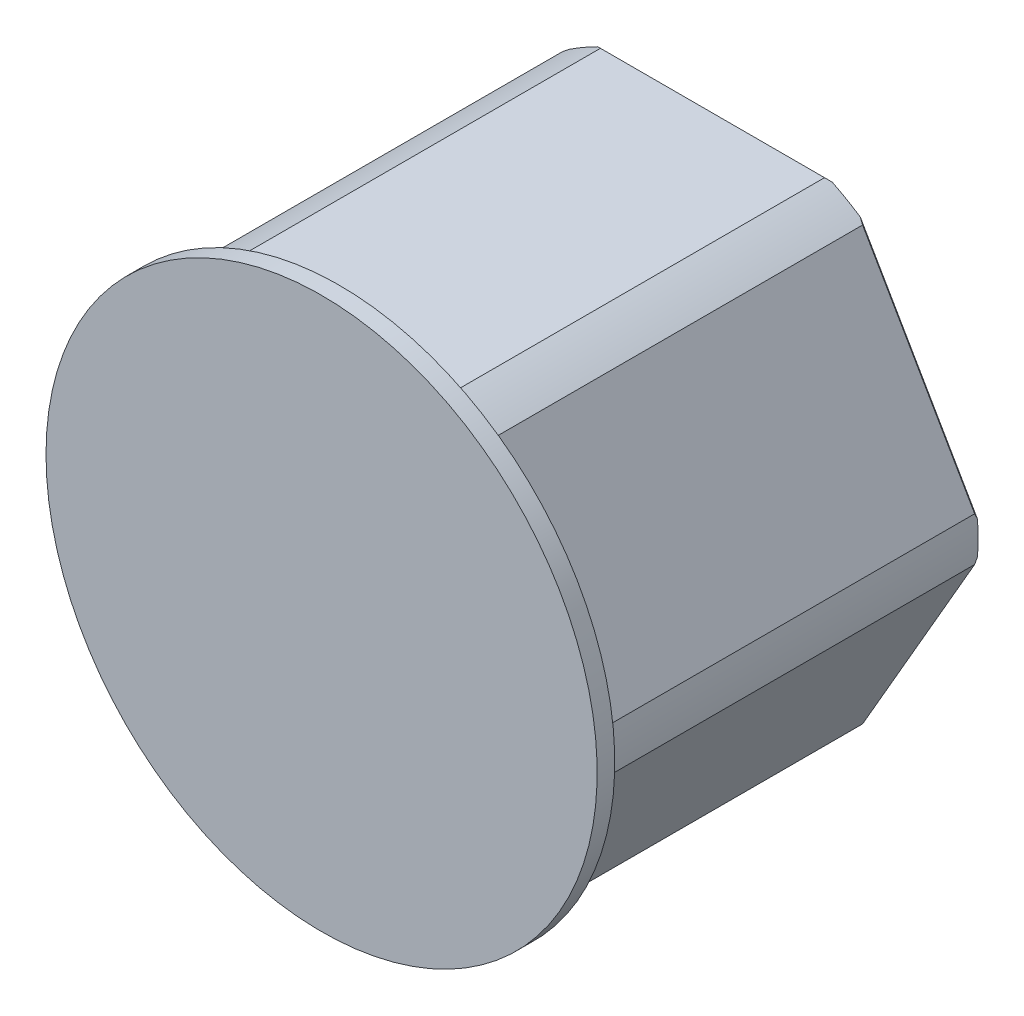
ISO-10303-21;
HEADER;
FILE_DESCRIPTION(('STEP AP214'),'2;1');
FILE_NAME('part.step','',(''),(''),'','','');
FILE_SCHEMA(('AUTOMOTIVE_DESIGN { 1 0 10303 214 1 1 1 1 }'));
ENDSEC;
DATA;
#1=APPLICATION_CONTEXT('core data for automotive mechanical design processes');
#2=APPLICATION_PROTOCOL_DEFINITION('international standard','automotive_design',2000,#1);
#3=PRODUCT_CONTEXT('',#1,'mechanical');
#4=PRODUCT('Part','Part','',(#3));
#5=PRODUCT_RELATED_PRODUCT_CATEGORY('part','',(#4));
#6=PRODUCT_DEFINITION_FORMATION('','',#4);
#7=PRODUCT_DEFINITION_CONTEXT('part definition',#1,'design');
#8=PRODUCT_DEFINITION('design','',#6,#7);
#9=PRODUCT_DEFINITION_SHAPE('','',#8);
#10=(LENGTH_UNIT() NAMED_UNIT(*) SI_UNIT(.MILLI.,.METRE.));
#11=(NAMED_UNIT(*) PLANE_ANGLE_UNIT() SI_UNIT($,.RADIAN.));
#12=(NAMED_UNIT(*) SI_UNIT($,.STERADIAN.) SOLID_ANGLE_UNIT());
#13=UNCERTAINTY_MEASURE_WITH_UNIT(LENGTH_MEASURE(1.E-05),#10,'distance_accuracy_value','');
#14=(GEOMETRIC_REPRESENTATION_CONTEXT(3) GLOBAL_UNCERTAINTY_ASSIGNED_CONTEXT((#13)) GLOBAL_UNIT_ASSIGNED_CONTEXT((#10,
#11,#12)) REPRESENTATION_CONTEXT('',''));
#15=CARTESIAN_POINT('',(0.,0.,0.));
#16=DIRECTION('',(0.,0.,1.));
#17=DIRECTION('',(1.,0.,0.));
#18=AXIS2_PLACEMENT_3D('',#15,#16,#17);
#19=CARTESIAN_POINT('',(-175.,0.,-128.));
#20=DIRECTION('',(0.,0.,-1.));
#21=DIRECTION('',(-1.,0.,0.));
#22=AXIS2_PLACEMENT_3D('',#19,#20,#21);
#23=CYLINDRICAL_SURFACE('',#22,11.);
#24=CARTESIAN_POINT('',(-175.,0.,-134.297830772461));
#25=DIRECTION('',(0.,0.,1.));
#26=DIRECTION('',(-1.,0.,0.));
#27=AXIS2_PLACEMENT_3D('',#24,#25,#26);
#28=CIRCLE('',#27,11.);
#29=CARTESIAN_POINT('',(-186.,0.,-134.297830772461));
#30=VERTEX_POINT('',#29);
#31=EDGE_CURVE('E189',#30,#30,#28,.T.);
#32=ORIENTED_EDGE('',*,*,#31,.F.);
#33=EDGE_LOOP('',(#32));
#34=FACE_BOUND('',#33,.T.);
#35=CARTESIAN_POINT('',(-175.,0.,-135.));
#36=DIRECTION('',(0.,0.,-1.));
#37=DIRECTION('',(-1.,0.,0.));
#38=AXIS2_PLACEMENT_3D('',#35,#36,#37);
#39=CIRCLE('',#38,11.);
#40=CARTESIAN_POINT('',(-186.,0.,-135.));
#41=VERTEX_POINT('',#40);
#42=EDGE_CURVE('E182',#41,#41,#39,.T.);
#43=ORIENTED_EDGE('',*,*,#42,.F.);
#44=EDGE_LOOP('',(#43));
#45=FACE_BOUND('',#44,.T.);
#46=ADVANCED_FACE('F17',(#34,#45),#23,.T.);
#47=CARTESIAN_POINT('',(-175.,0.,-134.297830772461));
#48=DIRECTION('',(0.,0.,-1.));
#49=DIRECTION('',(-1.,0.,0.));
#50=AXIS2_PLACEMENT_3D('',#47,#48,#49);
#51=PLANE('',#50);
#52=ORIENTED_EDGE('',*,*,#31,.T.);
#53=EDGE_LOOP('',(#52));
#54=FACE_BOUND('',#53,.T.);
#55=ADVANCED_FACE('F683',(#54),#51,.F.);
#56=CARTESIAN_POINT('',(-175.,0.,-135.));
#57=DIRECTION('',(0.,0.,-1.));
#58=DIRECTION('',(-1.,0.,0.));
#59=AXIS2_PLACEMENT_3D('',#56,#57,#58);
#60=PLANE('',#59);
#61=CARTESIAN_POINT('',(-175.,0.,-135.));
#62=DIRECTION('',(0.,0.,-1.));
#63=DIRECTION('',(-0.425917709999994,-0.904761904761889,0.));
#64=AXIS2_PLACEMENT_3D('',#61,#62,#63);
#65=CIRCLE('',#64,10.5);
#66=CARTESIAN_POINT('',(-179.472135955,-9.5,-135.));
#67=VERTEX_POINT('',#66);
#68=CARTESIAN_POINT('',(-180.991173358452,-8.62298334620741,-135.));
#69=VERTEX_POINT('',#68);
#70=EDGE_CURVE('E162',#67,#69,#65,.T.);
#71=ORIENTED_EDGE('',*,*,#70,.F.);
#72=DIRECTION('',(-1.,0.,0.));
#73=VECTOR('',#72,1.);
#74=CARTESIAN_POINT('',(-170.527864045,-9.5,-135.));
#75=LINE('',#74,#73);
#76=CARTESIAN_POINT('',(-170.527864045,-9.5,-135.));
#77=VERTEX_POINT('',#76);
#78=EDGE_CURVE('E150',#77,#67,#75,.T.);
#79=ORIENTED_EDGE('',*,*,#78,.F.);
#80=CARTESIAN_POINT('',(-175.,0.,-135.));
#81=DIRECTION('',(0.,0.,-1.));
#82=DIRECTION('',(0.5705879389002,-0.82123650916263,0.));
#83=AXIS2_PLACEMENT_3D('',#80,#81,#82);
#84=CIRCLE('',#83,10.5);
#85=CARTESIAN_POINT('',(-169.008826641548,-8.62298334620749,-135.));
#86=VERTEX_POINT('',#85);
#87=EDGE_CURVE('E161',#86,#77,#84,.T.);
#88=ORIENTED_EDGE('',*,*,#87,.F.);
#89=DIRECTION('',(-0.5,-0.866025403784438,0.));
#90=VECTOR('',#89,1.);
#91=CARTESIAN_POINT('',(-164.536690686548,-0.877016653792699,-135.));
#92=LINE('',#91,#90);
#93=CARTESIAN_POINT('',(-164.536690686548,-0.877016653792552,-135.));
#94=VERTEX_POINT('',#93);
#95=EDGE_CURVE('E199',#94,#86,#92,.T.);
#96=ORIENTED_EDGE('',*,*,#95,.F.);
#97=CARTESIAN_POINT('',(-175.,0.,-135.));
#98=DIRECTION('',(0.,0.,-1.));
#99=DIRECTION('',(0.996505648900187,0.0835253955992873,0.));
#100=AXIS2_PLACEMENT_3D('',#97,#98,#99);
#101=CIRCLE('',#100,10.5);
#102=CARTESIAN_POINT('',(-164.536690686548,0.877016653792483,-135.));
#103=VERTEX_POINT('',#102);
#104=EDGE_CURVE('E204',#103,#94,#101,.T.);
#105=ORIENTED_EDGE('',*,*,#104,.F.);
#106=DIRECTION('',(0.499999999999998,-0.86602540378444,0.));
#107=VECTOR('',#106,1.);
#108=CARTESIAN_POINT('',(-169.008826641548,8.62298334620771,-135.));
#109=LINE('',#108,#107);
#110=CARTESIAN_POINT('',(-169.008826641548,8.62298334620742,-135.));
#111=VERTEX_POINT('',#110);
#112=EDGE_CURVE('E209',#111,#103,#109,.T.);
#113=ORIENTED_EDGE('',*,*,#112,.F.);
#114=CARTESIAN_POINT('',(-175.,0.,-135.));
#115=DIRECTION('',(0.,0.,-1.));
#116=DIRECTION('',(0.425917709999992,0.90476190476189,0.));
#117=AXIS2_PLACEMENT_3D('',#114,#115,#116);
#118=CIRCLE('',#117,10.5);
#119=CARTESIAN_POINT('',(-170.527864045,9.5,-135.));
#120=VERTEX_POINT('',#119);
#121=EDGE_CURVE('E214',#120,#111,#118,.T.);
#122=ORIENTED_EDGE('',*,*,#121,.F.);
#123=DIRECTION('',(1.,0.,0.));
#124=VECTOR('',#123,1.);
#125=CARTESIAN_POINT('',(-179.472135955,9.5,-135.));
#126=LINE('',#125,#124);
#127=CARTESIAN_POINT('',(-179.472135955,9.5,-135.));
#128=VERTEX_POINT('',#127);
#129=EDGE_CURVE('E219',#128,#120,#126,.T.);
#130=ORIENTED_EDGE('',*,*,#129,.F.);
#131=CARTESIAN_POINT('',(-175.,0.,-135.));
#132=DIRECTION('',(0.,0.,-1.));
#133=DIRECTION('',(-0.570587938900203,0.821236509162627,0.));
#134=AXIS2_PLACEMENT_3D('',#131,#132,#133);
#135=CIRCLE('',#134,10.5);
#136=CARTESIAN_POINT('',(-180.991173358452,8.62298334620734,-135.));
#137=VERTEX_POINT('',#136);
#138=EDGE_CURVE('E224',#137,#128,#135,.T.);
#139=ORIENTED_EDGE('',*,*,#138,.F.);
#140=DIRECTION('',(0.500000000000001,0.866025403784438,0.));
#141=VECTOR('',#140,1.);
#142=CARTESIAN_POINT('',(-185.463309313452,0.877016653792736,-135.));
#143=LINE('',#142,#141);
#144=CARTESIAN_POINT('',(-185.463309313452,0.877016653792622,-135.));
#145=VERTEX_POINT('',#144);
#146=EDGE_CURVE('E229',#145,#137,#143,.T.);
#147=ORIENTED_EDGE('',*,*,#146,.F.);
#148=CARTESIAN_POINT('',(-175.,0.,-135.));
#149=DIRECTION('',(0.,0.,-1.));
#150=DIRECTION('',(-0.996505648900186,-0.0835253955993006,0.));
#151=AXIS2_PLACEMENT_3D('',#148,#149,#150);
#152=CIRCLE('',#151,10.5);
#153=CARTESIAN_POINT('',(-185.463309313452,-0.877016653792695,-135.));
#154=VERTEX_POINT('',#153);
#155=EDGE_CURVE('E234',#154,#145,#152,.T.);
#156=ORIENTED_EDGE('',*,*,#155,.F.);
#157=DIRECTION('',(-0.499999999999999,0.866025403784439,0.));
#158=VECTOR('',#157,1.);
#159=CARTESIAN_POINT('',(-180.991173358453,-8.62298334620772,-135.));
#160=LINE('',#159,#158);
#161=EDGE_CURVE('E180',#69,#154,#160,.T.);
#162=ORIENTED_EDGE('',*,*,#161,.F.);
#163=EDGE_LOOP('',(#71,#79,#88,#96,#105,#113,#122,#130,#139,#147,#156,#162));
#164=FACE_BOUND('',#163,.T.);
#165=ORIENTED_EDGE('',*,*,#42,.T.);
#166=EDGE_LOOP('',(#165));
#167=FACE_BOUND('',#166,.T.);
#168=ADVANCED_FACE('F177',(#164,#167),#60,.T.);
#169=CARTESIAN_POINT('',(-175.,0.,-135.));
#170=DIRECTION('',(0.,0.,-1.));
#171=DIRECTION('',(-1.,0.,0.));
#172=AXIS2_PLACEMENT_3D('',#169,#170,#171);
#173=CYLINDRICAL_SURFACE('',#172,10.5);
#174=CARTESIAN_POINT('',(-180.801301282516,-8.75185142866796,-150.000000000001));
#175=CARTESIAN_POINT('',(-180.833122793573,-8.73075804352367,-149.98298845561));
#176=CARTESIAN_POINT('',(-180.864942696883,-8.70941502160958,-149.966103121955));
#177=CARTESIAN_POINT('',(-180.928236057827,-8.66645718266959,-149.932768382957));
#178=CARTESIAN_POINT('',(-180.959707281261,-8.64484570124045,-149.916319244689));
#179=CARTESIAN_POINT('',(-180.991173358452,-8.62298334620747,-149.900000000001));
#180=B_SPLINE_CURVE_WITH_KNOTS('',3,(#174,#175,#176,#177,#178,#179),.UNSPECIFIED.,.F.,.F.,(4,2,
4),(2.67976158239654,2.6906891405977,2.70161669879885),.UNSPECIFIED.);
#181=CARTESIAN_POINT('',(-180.801301282516,-8.75185142866817,-150.));
#182=VERTEX_POINT('',#181);
#183=CARTESIAN_POINT('',(-180.991173358452,-8.62298334620742,-149.9));
#184=VERTEX_POINT('',#183);
#185=EDGE_CURVE('E243',#182,#184,#180,.T.);
#186=ORIENTED_EDGE('',*,*,#185,.F.);
#187=CARTESIAN_POINT('',(-175.,0.,-150.));
#188=DIRECTION('',(0.,0.,-1.));
#189=DIRECTION('',(-0.445588097725331,-0.895238095238089,0.));
#190=AXIS2_PLACEMENT_3D('',#187,#188,#189);
#191=CIRCLE('',#190,10.5);
#192=CARTESIAN_POINT('',(-179.678675026116,-9.4,-150.));
#193=VERTEX_POINT('',#192);
#194=EDGE_CURVE('E251',#193,#182,#191,.T.);
#195=ORIENTED_EDGE('',*,*,#194,.F.);
#196=CARTESIAN_POINT('',(-179.472135955,-9.49999999999948,-149.900000000001));
#197=CARTESIAN_POINT('',(-179.50680234844,-9.48368075531161,-149.916319244688));
#198=CARTESIAN_POINT('',(-179.541254052089,-9.46723161704344,-149.932768382957));
#199=CARTESIAN_POINT('',(-179.610103312374,-9.43389687804542,-149.966103121955));
#200=CARTESIAN_POINT('',(-179.6444968632,-9.41701154439017,-149.98298845561));
#201=CARTESIAN_POINT('',(-179.678675026116,-9.39999999999954,-150.));
#202=B_SPLINE_CURVE_WITH_KNOTS('',3,(#196,#197,#198,#199,#200,#201),.UNSPECIFIED.,.F.,.F.,(4,2,
4),(3.58156860838075,3.59249616658191,3.60342372478308),.UNSPECIFIED.);
#203=CARTESIAN_POINT('',(-179.472135955,-9.5,-149.9));
#204=VERTEX_POINT('',#203);
#205=EDGE_CURVE('E171',#204,#193,#202,.T.);
#206=ORIENTED_EDGE('',*,*,#205,.F.);
#207=DIRECTION('',(0.,0.,-1.));
#208=VECTOR('',#207,1.);
#209=CARTESIAN_POINT('',(-179.472135955,-9.5,-135.));
#210=LINE('',#209,#208);
#211=EDGE_CURVE('E154',#67,#204,#210,.T.);
#212=ORIENTED_EDGE('',*,*,#211,.F.);
#213=ORIENTED_EDGE('',*,*,#70,.T.);
#214=DIRECTION('',(0.,0.,1.));
#215=VECTOR('',#214,1.);
#216=CARTESIAN_POINT('',(-180.991173358452,-8.62298334620741,-149.9));
#217=LINE('',#216,#215);
#218=EDGE_CURVE('E174',#184,#69,#217,.T.);
#219=ORIENTED_EDGE('',*,*,#218,.F.);
#220=EDGE_LOOP('',(#186,#195,#206,#212,#213,#219));
#221=FACE_BOUND('',#220,.T.);
#222=ADVANCED_FACE('F168',(#221),#173,.T.);
#223=CARTESIAN_POINT('',(-169.655844313645,-9.5,-135.));
#224=DIRECTION('',(0.,-1.,0.));
#225=DIRECTION('',(-1.,0.,0.));
#226=AXIS2_PLACEMENT_3D('',#223,#224,#225);
#227=PLANE('',#226);
#228=ORIENTED_EDGE('',*,*,#78,.T.);
#229=ORIENTED_EDGE('',*,*,#211,.T.);
#230=DIRECTION('',(1.,0.,0.));
#231=VECTOR('',#230,1.);
#232=CARTESIAN_POINT('',(-179.472135955,-9.5,-149.9));
#233=LINE('',#232,#231);
#234=CARTESIAN_POINT('',(-170.527864045,-9.5,-149.9));
#235=VERTEX_POINT('',#234);
#236=EDGE_CURVE('E1067',#204,#235,#233,.T.);
#237=ORIENTED_EDGE('',*,*,#236,.T.);
#238=DIRECTION('',(0.,0.,1.));
#239=VECTOR('',#238,1.);
#240=CARTESIAN_POINT('',(-170.527864045,-9.5,-149.9));
#241=LINE('',#240,#239);
#242=EDGE_CURVE('E156',#235,#77,#241,.T.);
#243=ORIENTED_EDGE('',*,*,#242,.T.);
#244=EDGE_LOOP('',(#228,#229,#237,#243));
#245=FACE_BOUND('',#244,.T.);
#246=ADVANCED_FACE('F152',(#245),#227,.T.);
#247=CARTESIAN_POINT('',(-170.321324973884,-9.39999999999955,-150.));
#248=CARTESIAN_POINT('',(-170.3555031368,-9.41701154439018,-149.98298845561));
#249=CARTESIAN_POINT('',(-170.389896687626,-9.43389687804543,-149.966103121955));
#250=CARTESIAN_POINT('',(-170.458745947911,-9.46723161704345,-149.932768382957));
#251=CARTESIAN_POINT('',(-170.49319765156,-9.4836807553116,-149.916319244688));
#252=CARTESIAN_POINT('',(-170.527864045,-9.49999999999947,-149.900000000001));
#253=B_SPLINE_CURVE_WITH_KNOTS('',3,(#247,#248,#249,#250,#251,#252),.UNSPECIFIED.,.F.,.F.,(4,2,
4),(2.67976158239652,2.69068914059767,2.70161669879883),.UNSPECIFIED.);
#254=CARTESIAN_POINT('',(-170.321324973884,-9.4,-150.));
#255=VERTEX_POINT('',#254);
#256=EDGE_CURVE('E340',#255,#235,#253,.T.);
#257=ORIENTED_EDGE('',*,*,#256,.F.);
#258=CARTESIAN_POINT('',(-175.,0.,-150.));
#259=DIRECTION('',(0.,0.,-1.));
#260=DIRECTION('',(0.552504884049134,-0.833509659873149,0.));
#261=AXIS2_PLACEMENT_3D('',#258,#259,#260);
#262=CIRCLE('',#261,10.5);
#263=CARTESIAN_POINT('',(-169.198698717484,-8.75185142866823,-150.));
#264=VERTEX_POINT('',#263);
#265=EDGE_CURVE('E330',#264,#255,#262,.T.);
#266=ORIENTED_EDGE('',*,*,#265,.F.);
#267=CARTESIAN_POINT('',(-169.008826641548,-8.62298334620767,-149.900000000001));
#268=CARTESIAN_POINT('',(-169.040292718739,-8.64484570124064,-149.916319244688));
#269=CARTESIAN_POINT('',(-169.071763942173,-8.66645718266978,-149.932768382957));
#270=CARTESIAN_POINT('',(-169.135057303117,-8.70941502160978,-149.966103121955));
#271=CARTESIAN_POINT('',(-169.166877206427,-8.73075804352385,-149.98298845561));
#272=CARTESIAN_POINT('',(-169.198698717484,-8.75185142866815,-150.));
#273=B_SPLINE_CURVE_WITH_KNOTS('',3,(#267,#268,#269,#270,#271,#272),.UNSPECIFIED.,.F.,.F.,(4,2,
4),(3.58156860838076,3.59249616658191,3.60342372478306),.UNSPECIFIED.);
#274=CARTESIAN_POINT('',(-169.008826641548,-8.62298334620749,-149.9));
#275=VERTEX_POINT('',#274);
#276=EDGE_CURVE('E339',#275,#264,#273,.T.);
#277=ORIENTED_EDGE('',*,*,#276,.F.);
#278=DIRECTION('',(0.,0.,-1.));
#279=VECTOR('',#278,1.);
#280=CARTESIAN_POINT('',(-169.008826641548,-8.62298334620749,-135.));
#281=LINE('',#280,#279);
#282=EDGE_CURVE('E347',#86,#275,#281,.T.);
#283=ORIENTED_EDGE('',*,*,#282,.F.);
#284=ORIENTED_EDGE('',*,*,#87,.T.);
#285=ORIENTED_EDGE('',*,*,#242,.F.);
#286=EDGE_LOOP('',(#257,#266,#277,#283,#284,#285));
#287=FACE_BOUND('',#286,.T.);
#288=ADVANCED_FACE('F263',(#287),#173,.T.);
#289=CARTESIAN_POINT('',(-164.10068082087,-0.121825413837582,-135.));
#290=DIRECTION('',(0.866025403784439,-0.5,0.));
#291=DIRECTION('',(-0.5,-0.866025403784439,0.));
#292=AXIS2_PLACEMENT_3D('',#289,#290,#291);
#293=PLANE('',#292);
#294=ORIENTED_EDGE('',*,*,#95,.T.);
#295=ORIENTED_EDGE('',*,*,#282,.T.);
#296=DIRECTION('',(0.500000000000001,0.866025403784438,0.));
#297=VECTOR('',#296,1.);
#298=CARTESIAN_POINT('',(-169.008826641547,-8.62298334620781,-149.9));
#299=LINE('',#298,#297);
#300=CARTESIAN_POINT('',(-164.536690686548,-0.877016653792555,-149.9));
#301=VERTEX_POINT('',#300);
#302=EDGE_CURVE('E356',#275,#301,#299,.T.);
#303=ORIENTED_EDGE('',*,*,#302,.T.);
#304=DIRECTION('',(0.,0.,1.));
#305=VECTOR('',#304,1.);
#306=CARTESIAN_POINT('',(-164.536690686548,-0.877016653792552,-149.9));
#307=LINE('',#306,#305);
#308=EDGE_CURVE('E363',#301,#94,#307,.T.);
#309=ORIENTED_EDGE('',*,*,#308,.T.);
#310=EDGE_LOOP('',(#294,#295,#303,#309));
#311=FACE_BOUND('',#310,.T.);
#312=ADVANCED_FACE('F354',(#311),#293,.T.);
#313=CARTESIAN_POINT('',(-164.520023691368,-0.648148571331565,-150.));
#314=CARTESIAN_POINT('',(-164.522380343226,-0.686253500866546,-149.98298845561));
#315=CARTESIAN_POINT('',(-164.524953990743,-0.724481856435935,-149.966103121955));
#316=CARTESIAN_POINT('',(-164.530509890085,-0.800774434374051,-149.932768382957));
#317=CARTESIAN_POINT('',(-164.533490370298,-0.838835054071398,-149.916319244688));
#318=CARTESIAN_POINT('',(-164.536690686548,-0.877016653792296,-149.9));
#319=B_SPLINE_CURVE_WITH_KNOTS('',3,(#313,#314,#315,#316,#317,#318),.UNSPECIFIED.,.F.,.F.,(4,2,
4),(2.67976158239651,2.69068914059768,2.70161669879885),.UNSPECIFIED.);
#320=CARTESIAN_POINT('',(-164.520023691368,-0.648148571331795,-150.));
#321=VERTEX_POINT('',#320);
#322=EDGE_CURVE('E372',#321,#301,#319,.T.);
#323=ORIENTED_EDGE('',*,*,#322,.F.);
#324=CARTESIAN_POINT('',(-175.,0.,-150.));
#325=DIRECTION('',(0.,0.,-1.));
#326=DIRECTION('',(0.998092981774443,0.0617284353649286,0.));
#327=AXIS2_PLACEMENT_3D('',#324,#325,#326);
#328=CIRCLE('',#327,10.5);
#329=CARTESIAN_POINT('',(-164.520023691368,0.64814857133173,-150.));
#330=VERTEX_POINT('',#329);
#331=EDGE_CURVE('E380',#330,#321,#328,.T.);
#332=ORIENTED_EDGE('',*,*,#331,.F.);
#333=CARTESIAN_POINT('',(-164.536690686548,0.87701665379257,-149.9));
#334=CARTESIAN_POINT('',(-164.533490370298,0.838835054071674,-149.916319244688));
#335=CARTESIAN_POINT('',(-164.530509890084,0.80077443437433,-149.932768382956));
#336=CARTESIAN_POINT('',(-164.524953990743,0.724481856436209,-149.966103121954));
#337=CARTESIAN_POINT('',(-164.522380343226,0.686253500866825,-149.98298845561));
#338=CARTESIAN_POINT('',(-164.520023691368,0.648148571331844,-150.));
#339=B_SPLINE_CURVE_WITH_KNOTS('',3,(#333,#334,#335,#336,#337,#338),.UNSPECIFIED.,.F.,.F.,(4,2,
4),(3.58156860838071,3.59249616658188,3.60342372478305),.UNSPECIFIED.);
#340=CARTESIAN_POINT('',(-164.536690686548,0.877016653792491,-149.9));
#341=VERTEX_POINT('',#340);
#342=EDGE_CURVE('E389',#341,#330,#339,.T.);
#343=ORIENTED_EDGE('',*,*,#342,.F.);
#344=DIRECTION('',(0.,0.,-1.));
#345=VECTOR('',#344,1.);
#346=CARTESIAN_POINT('',(-164.536690686548,0.877016653792481,-135.));
#347=LINE('',#346,#345);
#348=EDGE_CURVE('E393',#103,#341,#347,.T.);
#349=ORIENTED_EDGE('',*,*,#348,.F.);
#350=ORIENTED_EDGE('',*,*,#104,.T.);
#351=ORIENTED_EDGE('',*,*,#308,.F.);
#352=EDGE_LOOP('',(#323,#332,#343,#349,#350,#351));
#353=FACE_BOUND('',#352,.T.);
#354=ADVANCED_FACE('F378',(#353),#173,.T.);
#355=CARTESIAN_POINT('',(-169.444836507225,9.37817458616242,-135.));
#356=DIRECTION('',(0.866025403784439,0.5,0.));
#357=DIRECTION('',(0.5,-0.866025403784439,0.));
#358=AXIS2_PLACEMENT_3D('',#355,#356,#357);
#359=PLANE('',#358);
#360=ORIENTED_EDGE('',*,*,#112,.T.);
#361=ORIENTED_EDGE('',*,*,#348,.T.);
#362=DIRECTION('',(-0.499999999999998,0.86602540378444,0.));
#363=VECTOR('',#362,1.);
#364=CARTESIAN_POINT('',(-164.536690686548,0.877016653792609,-149.9));
#365=LINE('',#364,#363);
#366=CARTESIAN_POINT('',(-169.008826641548,8.62298334620742,-149.9));
#367=VERTEX_POINT('',#366);
#368=EDGE_CURVE('E405',#341,#367,#365,.T.);
#369=ORIENTED_EDGE('',*,*,#368,.T.);
#370=DIRECTION('',(0.,0.,1.));
#371=VECTOR('',#370,1.);
#372=CARTESIAN_POINT('',(-169.008826641548,8.62298334620742,-149.9));
#373=LINE('',#372,#371);
#374=EDGE_CURVE('E412',#367,#111,#373,.T.);
#375=ORIENTED_EDGE('',*,*,#374,.T.);
#376=EDGE_LOOP('',(#360,#361,#369,#375));
#377=FACE_BOUND('',#376,.T.);
#378=ADVANCED_FACE('F403',(#377),#359,.T.);
#379=ORIENTED_EDGE('',*,*,#121,.T.);
#380=ORIENTED_EDGE('',*,*,#374,.F.);
#381=CARTESIAN_POINT('',(-169.198698717484,8.75185142866799,-150.));
#382=CARTESIAN_POINT('',(-169.166877206426,8.7307580435237,-149.98298845561));
#383=CARTESIAN_POINT('',(-169.135057303117,8.70941502160961,-149.966103121954));
#384=CARTESIAN_POINT('',(-169.071763942173,8.66645718266961,-149.932768382956));
#385=CARTESIAN_POINT('',(-169.040292718738,8.64484570124048,-149.916319244688));
#386=CARTESIAN_POINT('',(-169.008826641548,8.6229833462075,-149.9));
#387=B_SPLINE_CURVE_WITH_KNOTS('',3,(#381,#382,#383,#384,#385,#386),.UNSPECIFIED.,.F.,.F.,(4,2,
4),(2.67976158239656,2.6906891405977,2.70161669879885),.UNSPECIFIED.);
#388=CARTESIAN_POINT('',(-169.198698717484,8.75185142866816,-150.));
#389=VERTEX_POINT('',#388);
#390=EDGE_CURVE('E421',#389,#367,#387,.T.);
#391=ORIENTED_EDGE('',*,*,#390,.F.);
#392=CARTESIAN_POINT('',(-175.,0.,-150.));
#393=DIRECTION('',(0.,0.,-1.));
#394=DIRECTION('',(0.445588097725328,0.89523809523809,0.));
#395=AXIS2_PLACEMENT_3D('',#392,#393,#394);
#396=CIRCLE('',#395,10.5);
#397=CARTESIAN_POINT('',(-170.321324973884,9.4,-150.));
#398=VERTEX_POINT('',#397);
#399=EDGE_CURVE('E428',#398,#389,#396,.T.);
#400=ORIENTED_EDGE('',*,*,#399,.F.);
#401=CARTESIAN_POINT('',(-170.527864045,9.4999999999994,-149.900000000001));
#402=CARTESIAN_POINT('',(-170.49319765156,9.48368075531153,-149.916319244688));
#403=CARTESIAN_POINT('',(-170.458745947911,9.46723161704338,-149.932768382957));
#404=CARTESIAN_POINT('',(-170.389896687626,9.43389687804536,-149.966103121955));
#405=CARTESIAN_POINT('',(-170.3555031368,9.41701154439012,-149.98298845561));
#406=CARTESIAN_POINT('',(-170.321324973884,9.39999999999948,-150.000000000001));
#407=B_SPLINE_CURVE_WITH_KNOTS('',3,(#401,#402,#403,#404,#405,#406),.UNSPECIFIED.,.F.,.F.,(4,2,
4),(3.58156860838075,3.59249616658191,3.60342372478306),.UNSPECIFIED.);
#408=CARTESIAN_POINT('',(-170.527864045,9.5,-149.9));
#409=VERTEX_POINT('',#408);
#410=EDGE_CURVE('E433',#409,#398,#407,.T.);
#411=ORIENTED_EDGE('',*,*,#410,.F.);
#412=DIRECTION('',(0.,0.,-1.));
#413=VECTOR('',#412,1.);
#414=CARTESIAN_POINT('',(-170.527864045,9.5,-135.));
#415=LINE('',#414,#413);
#416=EDGE_CURVE('E437',#120,#409,#415,.T.);
#417=ORIENTED_EDGE('',*,*,#416,.F.);
#418=EDGE_LOOP('',(#379,#380,#391,#400,#411,#417));
#419=FACE_BOUND('',#418,.T.);
#420=ADVANCED_FACE('F426',(#419),#173,.T.);
#421=CARTESIAN_POINT('',(-180.344155686355,9.5,-135.));
#422=DIRECTION('',(0.,1.,0.));
#423=DIRECTION('',(1.,0.,0.));
#424=AXIS2_PLACEMENT_3D('',#421,#422,#423);
#425=PLANE('',#424);
#426=ORIENTED_EDGE('',*,*,#129,.T.);
#427=ORIENTED_EDGE('',*,*,#416,.T.);
#428=DIRECTION('',(-1.,0.,0.));
#429=VECTOR('',#428,1.);
#430=CARTESIAN_POINT('',(-170.527864045,9.5,-149.9));
#431=LINE('',#430,#429);
#432=CARTESIAN_POINT('',(-179.472135955,9.5,-149.9));
#433=VERTEX_POINT('',#432);
#434=EDGE_CURVE('E449',#409,#433,#431,.T.);
#435=ORIENTED_EDGE('',*,*,#434,.T.);
#436=DIRECTION('',(0.,0.,1.));
#437=VECTOR('',#436,1.);
#438=CARTESIAN_POINT('',(-179.472135955,9.5,-149.9));
#439=LINE('',#438,#437);
#440=EDGE_CURVE('E456',#433,#128,#439,.T.);
#441=ORIENTED_EDGE('',*,*,#440,.T.);
#442=EDGE_LOOP('',(#426,#427,#435,#441));
#443=FACE_BOUND('',#442,.T.);
#444=ADVANCED_FACE('F447',(#443),#425,.T.);
#445=ORIENTED_EDGE('',*,*,#138,.T.);
#446=ORIENTED_EDGE('',*,*,#440,.F.);
#447=CARTESIAN_POINT('',(-179.678675026116,9.39999999999948,-150.000000000001));
#448=CARTESIAN_POINT('',(-179.6444968632,9.41701154439011,-149.98298845561));
#449=CARTESIAN_POINT('',(-179.610103312374,9.43389687804536,-149.966103121955));
#450=CARTESIAN_POINT('',(-179.541254052089,9.46723161704338,-149.932768382957));
#451=CARTESIAN_POINT('',(-179.50680234844,9.48368075531153,-149.916319244688));
#452=CARTESIAN_POINT('',(-179.472135955,9.4999999999994,-149.900000000001));
#453=B_SPLINE_CURVE_WITH_KNOTS('',3,(#447,#448,#449,#450,#451,#452),.UNSPECIFIED.,.F.,.F.,(4,2,
4),(2.67976158239652,2.69068914059768,2.70161669879884),.UNSPECIFIED.);
#454=CARTESIAN_POINT('',(-179.678675026116,9.4,-150.));
#455=VERTEX_POINT('',#454);
#456=EDGE_CURVE('E465',#455,#433,#453,.T.);
#457=ORIENTED_EDGE('',*,*,#456,.F.);
#458=CARTESIAN_POINT('',(-175.,0.,-150.));
#459=DIRECTION('',(0.,0.,-1.));
#460=DIRECTION('',(-0.55250488404914,0.833509659873146,0.));
#461=AXIS2_PLACEMENT_3D('',#458,#459,#460);
#462=CIRCLE('',#461,10.5);
#463=CARTESIAN_POINT('',(-180.801301282516,8.75185142866808,-150.));
#464=VERTEX_POINT('',#463);
#465=EDGE_CURVE('E472',#464,#455,#462,.T.);
#466=ORIENTED_EDGE('',*,*,#465,.F.);
#467=CARTESIAN_POINT('',(-180.991173358452,8.62298334620753,-149.9));
#468=CARTESIAN_POINT('',(-180.959707281262,8.6448457012405,-149.916319244688));
#469=CARTESIAN_POINT('',(-180.928236057827,8.66645718266963,-149.932768382956));
#470=CARTESIAN_POINT('',(-180.864942696884,8.70941502160962,-149.966103121954));
#471=CARTESIAN_POINT('',(-180.833122793574,8.73075804352371,-149.982988455609));
#472=CARTESIAN_POINT('',(-180.801301282516,8.75185142866801,-150.));
#473=B_SPLINE_CURVE_WITH_KNOTS('',3,(#467,#468,#469,#470,#471,#472),.UNSPECIFIED.,.F.,.F.,(4,2,
4),(3.58156860838073,3.59249616658188,3.60342372478303),.UNSPECIFIED.);
#474=CARTESIAN_POINT('',(-180.991173358452,8.62298334620734,-149.9));
#475=VERTEX_POINT('',#474);
#476=EDGE_CURVE('E477',#475,#464,#473,.T.);
#477=ORIENTED_EDGE('',*,*,#476,.F.);
#478=DIRECTION('',(0.,0.,-1.));
#479=VECTOR('',#478,1.);
#480=CARTESIAN_POINT('',(-180.991173358452,8.62298334620734,-135.));
#481=LINE('',#480,#479);
#482=EDGE_CURVE('E481',#137,#475,#481,.T.);
#483=ORIENTED_EDGE('',*,*,#482,.F.);
#484=EDGE_LOOP('',(#445,#446,#457,#466,#477,#483));
#485=FACE_BOUND('',#484,.T.);
#486=ADVANCED_FACE('F470',(#485),#173,.T.);
#487=CARTESIAN_POINT('',(-185.89931917913,0.121825413837519,-135.));
#488=DIRECTION('',(-0.866025403784439,0.5,0.));
#489=DIRECTION('',(0.5,0.866025403784439,0.));
#490=AXIS2_PLACEMENT_3D('',#487,#488,#489);
#491=PLANE('',#490);
#492=ORIENTED_EDGE('',*,*,#146,.T.);
#493=ORIENTED_EDGE('',*,*,#482,.T.);
#494=DIRECTION('',(-0.500000000000001,-0.866025403784438,0.));
#495=VECTOR('',#494,1.);
#496=CARTESIAN_POINT('',(-180.991173358453,8.62298334620768,-149.9));
#497=LINE('',#496,#495);
#498=CARTESIAN_POINT('',(-185.463309313452,0.877016653792622,-149.9));
#499=VERTEX_POINT('',#498);
#500=EDGE_CURVE('E492',#475,#499,#497,.T.);
#501=ORIENTED_EDGE('',*,*,#500,.T.);
#502=DIRECTION('',(0.,0.,1.));
#503=VECTOR('',#502,1.);
#504=CARTESIAN_POINT('',(-185.463309313452,0.877016653792622,-149.9));
#505=LINE('',#504,#503);
#506=EDGE_CURVE('E499',#499,#145,#505,.T.);
#507=ORIENTED_EDGE('',*,*,#506,.T.);
#508=EDGE_LOOP('',(#492,#493,#501,#507));
#509=FACE_BOUND('',#508,.T.);
#510=ADVANCED_FACE('F490',(#509),#491,.T.);
#511=ORIENTED_EDGE('',*,*,#155,.T.);
#512=ORIENTED_EDGE('',*,*,#506,.F.);
#513=CARTESIAN_POINT('',(-185.479976308632,0.648148571331914,-150.));
#514=CARTESIAN_POINT('',(-185.477619656774,0.686253500866905,-149.98298845561));
#515=CARTESIAN_POINT('',(-185.475046009258,0.724481856436296,-149.966103121954));
#516=CARTESIAN_POINT('',(-185.469490109916,0.800774434374436,-149.932768382956));
#517=CARTESIAN_POINT('',(-185.466509629702,0.838835054071785,-149.916319244688));
#518=CARTESIAN_POINT('',(-185.463309313452,0.877016653792688,-149.9));
#519=B_SPLINE_CURVE_WITH_KNOTS('',3,(#513,#514,#515,#516,#517,#518),.UNSPECIFIED.,.F.,.F.,(4,2,
4),(2.67976158239654,2.69068914059771,2.70161669879888),.UNSPECIFIED.);
#520=CARTESIAN_POINT('',(-185.479976308632,0.648148571331861,-150.));
#521=VERTEX_POINT('',#520);
#522=EDGE_CURVE('E508',#521,#499,#519,.T.);
#523=ORIENTED_EDGE('',*,*,#522,.F.);
#524=CARTESIAN_POINT('',(-175.,0.,-150.));
#525=DIRECTION('',(0.,0.,-1.));
#526=DIRECTION('',(-0.998092981774442,-0.0617284353649376,0.));
#527=AXIS2_PLACEMENT_3D('',#524,#525,#526);
#528=CIRCLE('',#527,10.5);
#529=CARTESIAN_POINT('',(-185.479976308632,-0.648148571331903,-150.));
#530=VERTEX_POINT('',#529);
#531=EDGE_CURVE('E512',#530,#521,#528,.T.);
#532=ORIENTED_EDGE('',*,*,#531,.F.);
#533=CARTESIAN_POINT('',(-185.463309313452,-0.87701665379249,-149.900000000001));
#534=CARTESIAN_POINT('',(-185.466509629702,-0.83883505407158,-149.916319244688));
#535=CARTESIAN_POINT('',(-185.469490109915,-0.800774434374225,-149.932768382957));
#536=CARTESIAN_POINT('',(-185.475046009257,-0.724481856436081,-149.966103121955));
#537=CARTESIAN_POINT('',(-185.477619656773,-0.686253500866697,-149.98298845561));
#538=CARTESIAN_POINT('',(-185.479976308631,-0.648148571331705,-150.000000000001));
#539=B_SPLINE_CURVE_WITH_KNOTS('',3,(#533,#534,#535,#536,#537,#538),.UNSPECIFIED.,.F.,.F.,(4,2,
4),(3.58156860838071,3.59249616658188,3.60342372478306),.UNSPECIFIED.);
#540=CARTESIAN_POINT('',(-185.463309313452,-0.877016653792687,-149.9));
#541=VERTEX_POINT('',#540);
#542=EDGE_CURVE('E516',#541,#530,#539,.T.);
#543=ORIENTED_EDGE('',*,*,#542,.F.);
#544=DIRECTION('',(0.,0.,-1.));
#545=VECTOR('',#544,1.);
#546=CARTESIAN_POINT('',(-185.463309313452,-0.877016653792695,-135.));
#547=LINE('',#546,#545);
#548=EDGE_CURVE('E520',#154,#541,#547,.T.);
#549=ORIENTED_EDGE('',*,*,#548,.F.);
#550=EDGE_LOOP('',(#511,#512,#523,#532,#543,#549));
#551=FACE_BOUND('',#550,.T.);
#552=ADVANCED_FACE('F262',(#551),#173,.T.);
#553=CARTESIAN_POINT('',(-180.555163492775,-9.37817458616249,-135.));
#554=DIRECTION('',(-0.866025403784439,-0.5,0.));
#555=DIRECTION('',(-0.5,0.866025403784439,0.));
#556=AXIS2_PLACEMENT_3D('',#553,#554,#555);
#557=PLANE('',#556);
#558=ORIENTED_EDGE('',*,*,#161,.T.);
#559=ORIENTED_EDGE('',*,*,#548,.T.);
#560=DIRECTION('',(0.499999999999998,-0.86602540378444,0.));
#561=VECTOR('',#560,1.);
#562=CARTESIAN_POINT('',(-185.463309313452,-0.877016653792774,-149.9));
#563=LINE('',#562,#561);
#564=EDGE_CURVE('E37',#541,#184,#563,.T.);
#565=ORIENTED_EDGE('',*,*,#564,.T.);
#566=ORIENTED_EDGE('',*,*,#218,.T.);
#567=EDGE_LOOP('',(#558,#559,#565,#566));
#568=FACE_BOUND('',#567,.T.);
#569=ADVANCED_FACE('F527',(#568),#557,.T.);
#570=CARTESIAN_POINT('',(-176.265638795574,-16.6078493020361,-150.));
#571=DIRECTION('',(-0.612372435695767,-0.353553390593257,-0.70710678118658));
#572=DIRECTION('',(-0.755928946018484,0.,0.654653670707943));
#573=AXIS2_PLACEMENT_3D('',#570,#571,#572);
#574=PLANE('',#573);
#575=DIRECTION('',(-0.499999999999999,0.866025403784439,0.));
#576=VECTOR('',#575,1.);
#577=CARTESIAN_POINT('',(-180.801301282516,-8.751851428668,-150.));
#578=LINE('',#577,#576);
#579=EDGE_CURVE('E45',#182,#530,#578,.T.);
#580=ORIENTED_EDGE('',*,*,#579,.F.);
#581=ORIENTED_EDGE('',*,*,#185,.T.);
#582=ORIENTED_EDGE('',*,*,#564,.F.);
#583=ORIENTED_EDGE('',*,*,#542,.T.);
#584=EDGE_LOOP('',(#580,#581,#582,#583));
#585=FACE_BOUND('',#584,.T.);
#586=ADVANCED_FACE('F547',(#585),#574,.T.);
#587=CARTESIAN_POINT('',(-147.5,0.,-150.));
#588=DIRECTION('',(0.,0.,1.));
#589=DIRECTION('',(1.,0.,0.));
#590=AXIS2_PLACEMENT_3D('',#587,#588,#589);
#591=PLANE('',#590);
#592=ORIENTED_EDGE('',*,*,#399,.T.);
#593=DIRECTION('',(0.5,-0.866025403784439,0.));
#594=VECTOR('',#593,1.);
#595=CARTESIAN_POINT('',(-169.198698717484,8.75185142866798,-150.));
#596=LINE('',#595,#594);
#597=EDGE_CURVE('E387',#389,#330,#596,.T.);
#598=ORIENTED_EDGE('',*,*,#597,.T.);
#599=ORIENTED_EDGE('',*,*,#331,.T.);
#600=DIRECTION('',(-0.499999999999999,-0.866025403784439,0.));
#601=VECTOR('',#600,1.);
#602=CARTESIAN_POINT('',(-164.520023691368,-0.648148571331554,-150.));
#603=LINE('',#602,#601);
#604=EDGE_CURVE('E386',#321,#264,#603,.T.);
#605=ORIENTED_EDGE('',*,*,#604,.T.);
#606=ORIENTED_EDGE('',*,*,#265,.T.);
#607=DIRECTION('',(-1.,0.,0.));
#608=VECTOR('',#607,1.);
#609=CARTESIAN_POINT('',(-170.321324973884,-9.4,-150.));
#610=LINE('',#609,#608);
#611=EDGE_CURVE('E574',#255,#193,#610,.T.);
#612=ORIENTED_EDGE('',*,*,#611,.T.);
#613=ORIENTED_EDGE('',*,*,#194,.T.);
#614=ORIENTED_EDGE('',*,*,#579,.T.);
#615=ORIENTED_EDGE('',*,*,#531,.T.);
#616=DIRECTION('',(0.499999999999998,0.86602540378444,0.));
#617=VECTOR('',#616,1.);
#618=CARTESIAN_POINT('',(-185.479976308632,0.648148571331584,-150.));
#619=LINE('',#618,#617);
#620=EDGE_CURVE('E29',#521,#464,#619,.T.);
#621=ORIENTED_EDGE('',*,*,#620,.T.);
#622=ORIENTED_EDGE('',*,*,#465,.T.);
#623=DIRECTION('',(1.,0.,0.));
#624=VECTOR('',#623,1.);
#625=CARTESIAN_POINT('',(-179.678675026116,9.4,-150.));
#626=LINE('',#625,#624);
#627=EDGE_CURVE('E11',#455,#398,#626,.T.);
#628=ORIENTED_EDGE('',*,*,#627,.T.);
#629=EDGE_LOOP('',(#592,#598,#599,#605,#606,#612,#613,#614,#615,#621,#622,#628));
#630=FACE_BOUND('',#629,.T.);
#631=ADVANCED_FACE('F385',(#630),#591,.F.);
#632=CARTESIAN_POINT('',(-147.5,-9.4,-150.));
#633=DIRECTION('',(0.,-0.707106781186518,-0.707106781186577));
#634=DIRECTION('',(0.,0.707106781186577,-0.707106781186518));
#635=AXIS2_PLACEMENT_3D('',#632,#633,#634);
#636=PLANE('',#635);
#637=ORIENTED_EDGE('',*,*,#611,.F.);
#638=ORIENTED_EDGE('',*,*,#256,.T.);
#639=ORIENTED_EDGE('',*,*,#236,.F.);
#640=ORIENTED_EDGE('',*,*,#205,.T.);
#641=EDGE_LOOP('',(#637,#638,#639,#640));
#642=FACE_BOUND('',#641,.T.);
#643=ADVANCED_FACE('F594',(#642),#636,.T.);
#644=CARTESIAN_POINT('',(-159.984361204426,7.20784930203603,-150.));
#645=DIRECTION('',(0.612372435695776,-0.353553390593263,-0.707106781186569));
#646=DIRECTION('',(-0.755928946018474,0.,-0.654653670707954));
#647=AXIS2_PLACEMENT_3D('',#644,#645,#646);
#648=PLANE('',#647);
#649=ORIENTED_EDGE('',*,*,#604,.F.);
#650=ORIENTED_EDGE('',*,*,#322,.T.);
#651=ORIENTED_EDGE('',*,*,#302,.F.);
#652=ORIENTED_EDGE('',*,*,#276,.T.);
#653=EDGE_LOOP('',(#649,#650,#651,#652));
#654=FACE_BOUND('',#653,.T.);
#655=ADVANCED_FACE('F603',(#654),#648,.T.);
#656=CARTESIAN_POINT('',(-159.984361204426,-7.2078493020361,-150.));
#657=DIRECTION('',(0.612372435695785,0.353553390593269,-0.707106781186558));
#658=DIRECTION('',(-0.755928946018464,0.,-0.654653670707966));
#659=AXIS2_PLACEMENT_3D('',#656,#657,#658);
#660=PLANE('',#659);
#661=ORIENTED_EDGE('',*,*,#597,.F.);
#662=ORIENTED_EDGE('',*,*,#390,.T.);
#663=ORIENTED_EDGE('',*,*,#368,.F.);
#664=ORIENTED_EDGE('',*,*,#342,.T.);
#665=EDGE_LOOP('',(#661,#662,#663,#664));
#666=FACE_BOUND('',#665,.T.);
#667=ADVANCED_FACE('F634',(#666),#660,.T.);
#668=CARTESIAN_POINT('',(-147.5,9.4,-150.));
#669=DIRECTION('',(0.,0.707106781186516,-0.707106781186579));
#670=DIRECTION('',(0.,0.707106781186579,0.707106781186516));
#671=AXIS2_PLACEMENT_3D('',#668,#669,#670);
#672=PLANE('',#671);
#673=ORIENTED_EDGE('',*,*,#627,.F.);
#674=ORIENTED_EDGE('',*,*,#456,.T.);
#675=ORIENTED_EDGE('',*,*,#434,.F.);
#676=ORIENTED_EDGE('',*,*,#410,.T.);
#677=EDGE_LOOP('',(#673,#674,#675,#676));
#678=FACE_BOUND('',#677,.T.);
#679=ADVANCED_FACE('F642',(#678),#672,.T.);
#680=CARTESIAN_POINT('',(-176.265638795574,16.607849302036,-150.));
#681=DIRECTION('',(-0.612372435695791,0.353553390593272,-0.707106781186551));
#682=DIRECTION('',(-0.755928946018458,0.,0.654653670707973));
#683=AXIS2_PLACEMENT_3D('',#680,#681,#682);
#684=PLANE('',#683);
#685=ORIENTED_EDGE('',*,*,#620,.F.);
#686=ORIENTED_EDGE('',*,*,#522,.T.);
#687=ORIENTED_EDGE('',*,*,#500,.F.);
#688=ORIENTED_EDGE('',*,*,#476,.T.);
#689=EDGE_LOOP('',(#685,#686,#687,#688));
#690=FACE_BOUND('',#689,.T.);
#691=ADVANCED_FACE('F19',(#690),#684,.T.);
#692=CLOSED_SHELL('',(#46,#55,#168,#222,#246,#288,#312,#354,#378,#420,#444,#486,#510,#552,#569,
#586,#631,#643,#655,#667,#679,#691));
#693=MANIFOLD_SOLID_BREP('B1',#692);
#694=ADVANCED_BREP_SHAPE_REPRESENTATION('',(#18,#693),#14);
#695=SHAPE_DEFINITION_REPRESENTATION(#9,#694);
ENDSEC;
END-ISO-10303-21;
